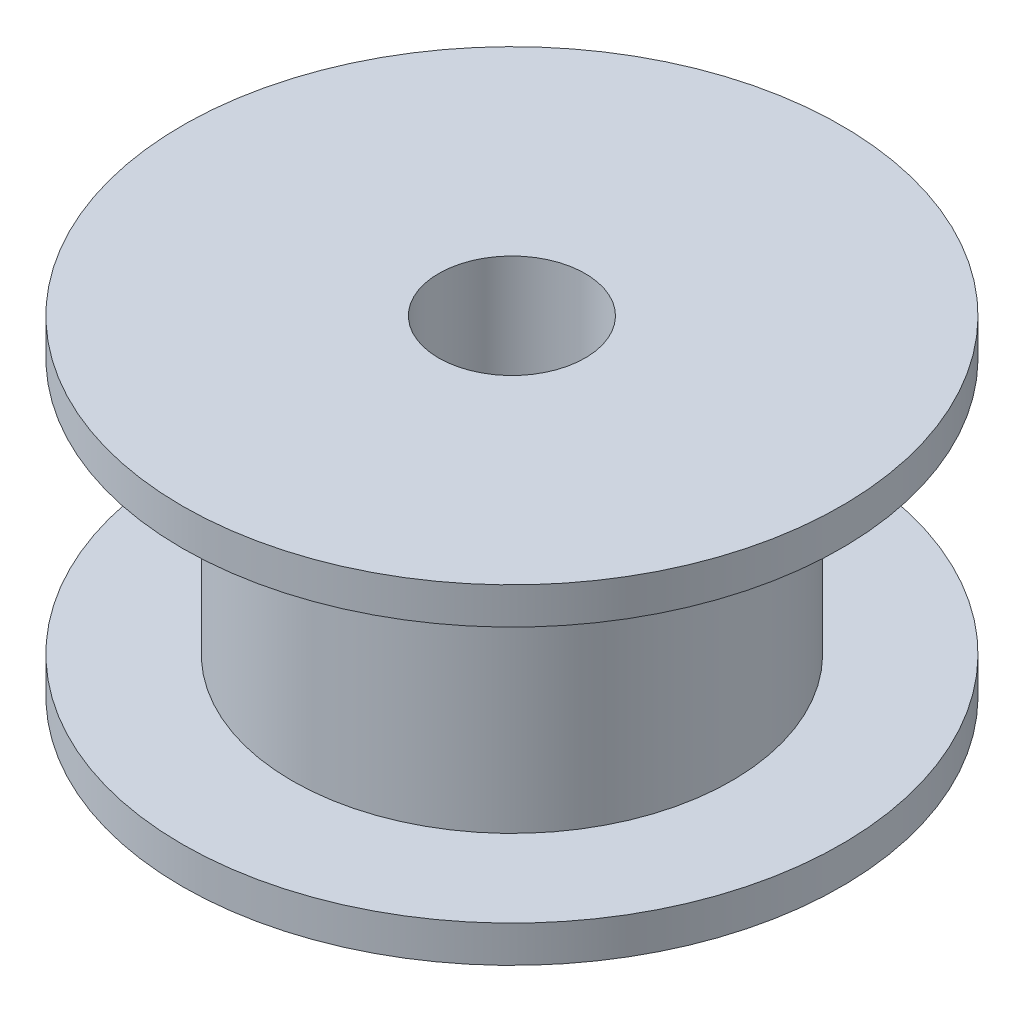
ISO-10303-21;
HEADER;
FILE_DESCRIPTION(('STEP AP214'),'2;1');
FILE_NAME('part.step','',(''),(''),'','','');
FILE_SCHEMA(('AUTOMOTIVE_DESIGN { 1 0 10303 214 1 1 1 1 }'));
ENDSEC;
DATA;
#1=APPLICATION_CONTEXT('core data for automotive mechanical design processes');
#2=APPLICATION_PROTOCOL_DEFINITION('international standard','automotive_design',2000,#1);
#3=PRODUCT_CONTEXT('',#1,'mechanical');
#4=PRODUCT('Part','Part','',(#3));
#5=PRODUCT_RELATED_PRODUCT_CATEGORY('part','',(#4));
#6=PRODUCT_DEFINITION_FORMATION('','',#4);
#7=PRODUCT_DEFINITION_CONTEXT('part definition',#1,'design');
#8=PRODUCT_DEFINITION('design','',#6,#7);
#9=PRODUCT_DEFINITION_SHAPE('','',#8);
#10=(LENGTH_UNIT() NAMED_UNIT(*) SI_UNIT(.MILLI.,.METRE.));
#11=(NAMED_UNIT(*) PLANE_ANGLE_UNIT() SI_UNIT($,.RADIAN.));
#12=(NAMED_UNIT(*) SI_UNIT($,.STERADIAN.) SOLID_ANGLE_UNIT());
#13=UNCERTAINTY_MEASURE_WITH_UNIT(LENGTH_MEASURE(1.E-05),#10,'distance_accuracy_value','');
#14=(GEOMETRIC_REPRESENTATION_CONTEXT(3) GLOBAL_UNCERTAINTY_ASSIGNED_CONTEXT((#13)) GLOBAL_UNIT_ASSIGNED_CONTEXT((#10,
#11,#12)) REPRESENTATION_CONTEXT('',''));
#15=CARTESIAN_POINT('',(0.,0.,0.));
#16=DIRECTION('',(0.,0.,1.));
#17=DIRECTION('',(1.,0.,0.));
#18=AXIS2_PLACEMENT_3D('',#15,#16,#17);
#19=CARTESIAN_POINT('',(0.,1.,0.));
#20=DIRECTION('',(0.,-1.,0.));
#21=DIRECTION('',(0.,0.,-1.));
#22=AXIS2_PLACEMENT_3D('',#19,#20,#21);
#23=CYLINDRICAL_SURFACE('',#22,9.);
#24=CARTESIAN_POINT('',(0.,1.,0.));
#25=DIRECTION('',(0.,1.,0.));
#26=DIRECTION('',(0.,0.,1.));
#27=AXIS2_PLACEMENT_3D('',#24,#25,#26);
#28=CIRCLE('',#27,9.);
#29=CARTESIAN_POINT('',(0.,1.,9.));
#30=VERTEX_POINT('',#29);
#31=EDGE_CURVE('E42',#30,#30,#28,.T.);
#32=ORIENTED_EDGE('',*,*,#31,.F.);
#33=EDGE_LOOP('',(#32));
#34=FACE_BOUND('',#33,.T.);
#35=CARTESIAN_POINT('',(0.,0.,0.));
#36=DIRECTION('',(0.,1.,0.));
#37=DIRECTION('',(0.,0.,1.));
#38=AXIS2_PLACEMENT_3D('',#35,#36,#37);
#39=CIRCLE('',#38,9.);
#40=CARTESIAN_POINT('',(0.,0.,9.));
#41=VERTEX_POINT('',#40);
#42=EDGE_CURVE('E38',#41,#41,#39,.T.);
#43=ORIENTED_EDGE('',*,*,#42,.T.);
#44=EDGE_LOOP('',(#43));
#45=FACE_BOUND('',#44,.T.);
#46=ADVANCED_FACE('F35',(#34,#45),#23,.T.);
#47=CARTESIAN_POINT('',(0.,1.,0.));
#48=DIRECTION('',(0.,1.,0.));
#49=DIRECTION('',(0.,0.,1.));
#50=AXIS2_PLACEMENT_3D('',#47,#48,#49);
#51=PLANE('',#50);
#52=CARTESIAN_POINT('',(0.,1.,0.));
#53=DIRECTION('',(0.,1.,0.));
#54=DIRECTION('',(0.,0.,1.));
#55=AXIS2_PLACEMENT_3D('',#52,#53,#54);
#56=CIRCLE('',#55,6.);
#57=CARTESIAN_POINT('',(0.,1.,6.));
#58=VERTEX_POINT('',#57);
#59=EDGE_CURVE('E10',#58,#58,#56,.T.);
#60=ORIENTED_EDGE('',*,*,#59,.F.);
#61=EDGE_LOOP('',(#60));
#62=FACE_BOUND('',#61,.T.);
#63=ORIENTED_EDGE('',*,*,#31,.T.);
#64=EDGE_LOOP('',(#63));
#65=FACE_BOUND('',#64,.T.);
#66=ADVANCED_FACE('F93',(#62,#65),#51,.T.);
#67=CARTESIAN_POINT('',(0.,0.,0.));
#68=DIRECTION('',(0.,1.,0.));
#69=DIRECTION('',(0.,0.,1.));
#70=AXIS2_PLACEMENT_3D('',#67,#68,#69);
#71=PLANE('',#70);
#72=CARTESIAN_POINT('',(0.,0.,0.));
#73=DIRECTION('',(0.,1.,0.));
#74=DIRECTION('',(0.,0.,1.));
#75=AXIS2_PLACEMENT_3D('',#72,#73,#74);
#76=CIRCLE('',#75,2.);
#77=CARTESIAN_POINT('',(0.,0.,2.));
#78=VERTEX_POINT('',#77);
#79=EDGE_CURVE('E55',#78,#78,#76,.T.);
#80=ORIENTED_EDGE('',*,*,#79,.T.);
#81=EDGE_LOOP('',(#80));
#82=FACE_BOUND('',#81,.T.);
#83=ORIENTED_EDGE('',*,*,#42,.F.);
#84=EDGE_LOOP('',(#83));
#85=FACE_BOUND('',#84,.T.);
#86=ADVANCED_FACE('F64',(#82,#85),#71,.F.);
#87=CARTESIAN_POINT('',(0.,8.,0.));
#88=DIRECTION('',(0.,-1.,0.));
#89=DIRECTION('',(0.,0.,-1.));
#90=AXIS2_PLACEMENT_3D('',#87,#88,#89);
#91=CYLINDRICAL_SURFACE('',#90,6.);
#92=CARTESIAN_POINT('',(0.,8.,0.));
#93=DIRECTION('',(0.,1.,0.));
#94=DIRECTION('',(0.,0.,1.));
#95=AXIS2_PLACEMENT_3D('',#92,#93,#94);
#96=CIRCLE('',#95,6.);
#97=CARTESIAN_POINT('',(0.,8.,6.));
#98=VERTEX_POINT('',#97);
#99=EDGE_CURVE('E48',#98,#98,#96,.T.);
#100=ORIENTED_EDGE('',*,*,#99,.F.);
#101=EDGE_LOOP('',(#100));
#102=FACE_BOUND('',#101,.T.);
#103=ORIENTED_EDGE('',*,*,#59,.T.);
#104=EDGE_LOOP('',(#103));
#105=FACE_BOUND('',#104,.T.);
#106=ADVANCED_FACE('F83',(#102,#105),#91,.T.);
#107=CARTESIAN_POINT('',(0.,9.,0.));
#108=DIRECTION('',(0.,-1.,0.));
#109=DIRECTION('',(0.,0.,-1.));
#110=AXIS2_PLACEMENT_3D('',#107,#108,#109);
#111=CYLINDRICAL_SURFACE('',#110,9.);
#112=CARTESIAN_POINT('',(0.,9.,0.));
#113=DIRECTION('',(0.,1.,0.));
#114=DIRECTION('',(0.,0.,1.));
#115=AXIS2_PLACEMENT_3D('',#112,#113,#114);
#116=CIRCLE('',#115,9.);
#117=CARTESIAN_POINT('',(0.,9.,9.));
#118=VERTEX_POINT('',#117);
#119=EDGE_CURVE('E51',#118,#118,#116,.T.);
#120=ORIENTED_EDGE('',*,*,#119,.F.);
#121=EDGE_LOOP('',(#120));
#122=FACE_BOUND('',#121,.T.);
#123=CARTESIAN_POINT('',(0.,8.,0.));
#124=DIRECTION('',(0.,1.,0.));
#125=DIRECTION('',(0.,0.,1.));
#126=AXIS2_PLACEMENT_3D('',#123,#124,#125);
#127=CIRCLE('',#126,9.);
#128=CARTESIAN_POINT('',(0.,8.,9.));
#129=VERTEX_POINT('',#128);
#130=EDGE_CURVE('E52',#129,#129,#127,.T.);
#131=ORIENTED_EDGE('',*,*,#130,.T.);
#132=EDGE_LOOP('',(#131));
#133=FACE_BOUND('',#132,.T.);
#134=ADVANCED_FACE('F77',(#122,#133),#111,.T.);
#135=CARTESIAN_POINT('',(0.,9.,0.));
#136=DIRECTION('',(0.,1.,0.));
#137=DIRECTION('',(0.,0.,1.));
#138=AXIS2_PLACEMENT_3D('',#135,#136,#137);
#139=PLANE('',#138);
#140=CARTESIAN_POINT('',(0.,9.,0.));
#141=DIRECTION('',(0.,1.,0.));
#142=DIRECTION('',(0.,0.,1.));
#143=AXIS2_PLACEMENT_3D('',#140,#141,#142);
#144=CIRCLE('',#143,2.);
#145=CARTESIAN_POINT('',(0.,9.,2.));
#146=VERTEX_POINT('',#145);
#147=EDGE_CURVE('E58',#146,#146,#144,.T.);
#148=ORIENTED_EDGE('',*,*,#147,.F.);
#149=EDGE_LOOP('',(#148));
#150=FACE_BOUND('',#149,.T.);
#151=ORIENTED_EDGE('',*,*,#119,.T.);
#152=EDGE_LOOP('',(#151));
#153=FACE_BOUND('',#152,.T.);
#154=ADVANCED_FACE('F74',(#150,#153),#139,.T.);
#155=CARTESIAN_POINT('',(0.,8.,0.));
#156=DIRECTION('',(0.,1.,0.));
#157=DIRECTION('',(0.,0.,1.));
#158=AXIS2_PLACEMENT_3D('',#155,#156,#157);
#159=PLANE('',#158);
#160=ORIENTED_EDGE('',*,*,#99,.T.);
#161=EDGE_LOOP('',(#160));
#162=FACE_BOUND('',#161,.T.);
#163=ORIENTED_EDGE('',*,*,#130,.F.);
#164=EDGE_LOOP('',(#163));
#165=FACE_BOUND('',#164,.T.);
#166=ADVANCED_FACE('F70',(#162,#165),#159,.F.);
#167=CARTESIAN_POINT('',(0.,0.,0.));
#168=DIRECTION('',(0.,1.,0.));
#169=DIRECTION('',(0.,0.,1.));
#170=AXIS2_PLACEMENT_3D('',#167,#168,#169);
#171=CYLINDRICAL_SURFACE('',#170,2.);
#172=ORIENTED_EDGE('',*,*,#79,.F.);
#173=EDGE_LOOP('',(#172));
#174=FACE_BOUND('',#173,.T.);
#175=ORIENTED_EDGE('',*,*,#147,.T.);
#176=EDGE_LOOP('',(#175));
#177=FACE_BOUND('',#176,.T.);
#178=ADVANCED_FACE('F67',(#174,#177),#171,.F.);
#179=CLOSED_SHELL('',(#46,#66,#86,#106,#134,#154,#166,#178));
#180=MANIFOLD_SOLID_BREP('B2',#179);
#181=ADVANCED_BREP_SHAPE_REPRESENTATION('',(#18,#180),#14);
#182=SHAPE_DEFINITION_REPRESENTATION(#9,#181);
ENDSEC;
END-ISO-10303-21;
